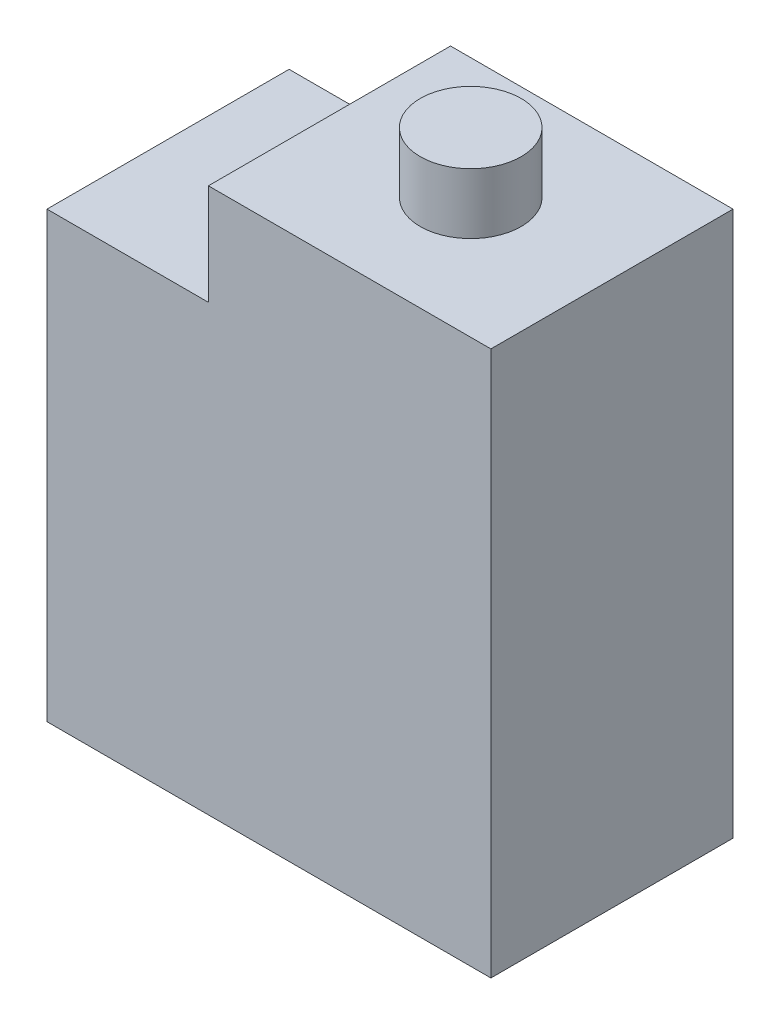
ISO-10303-21;
HEADER;
FILE_DESCRIPTION(('STEP AP214'),'2;1');
FILE_NAME('part.step','',(''),(''),'','','');
FILE_SCHEMA(('AUTOMOTIVE_DESIGN { 1 0 10303 214 1 1 1 1 }'));
ENDSEC;
DATA;
#1=APPLICATION_CONTEXT('core data for automotive mechanical design processes');
#2=APPLICATION_PROTOCOL_DEFINITION('international standard','automotive_design',2000,#1);
#3=PRODUCT_CONTEXT('',#1,'mechanical');
#4=PRODUCT('Part','Part','',(#3));
#5=PRODUCT_RELATED_PRODUCT_CATEGORY('part','',(#4));
#6=PRODUCT_DEFINITION_FORMATION('','',#4);
#7=PRODUCT_DEFINITION_CONTEXT('part definition',#1,'design');
#8=PRODUCT_DEFINITION('design','',#6,#7);
#9=PRODUCT_DEFINITION_SHAPE('','',#8);
#10=(LENGTH_UNIT() NAMED_UNIT(*) SI_UNIT(.MILLI.,.METRE.));
#11=(NAMED_UNIT(*) PLANE_ANGLE_UNIT() SI_UNIT($,.RADIAN.));
#12=(NAMED_UNIT(*) SI_UNIT($,.STERADIAN.) SOLID_ANGLE_UNIT());
#13=UNCERTAINTY_MEASURE_WITH_UNIT(LENGTH_MEASURE(1.E-05),#10,'distance_accuracy_value','');
#14=(GEOMETRIC_REPRESENTATION_CONTEXT(3) GLOBAL_UNCERTAINTY_ASSIGNED_CONTEXT((#13)) GLOBAL_UNIT_ASSIGNED_CONTEXT((#10,
#11,#12)) REPRESENTATION_CONTEXT('',''));
#15=CARTESIAN_POINT('',(0.,0.,0.));
#16=DIRECTION('',(0.,0.,1.));
#17=DIRECTION('',(1.,0.,0.));
#18=AXIS2_PLACEMENT_3D('',#15,#16,#17);
#19=CARTESIAN_POINT('',(0.,22.,0.));
#20=DIRECTION('',(0.,-1.,0.));
#21=DIRECTION('',(0.,0.,-1.));
#22=AXIS2_PLACEMENT_3D('',#19,#20,#21);
#23=PLANE('',#22);
#24=DIRECTION('',(0.,0.,1.));
#25=VECTOR('',#24,1.);
#26=CARTESIAN_POINT('',(-3.,22.,-6.));
#27=LINE('',#26,#25);
#28=CARTESIAN_POINT('',(-3.,22.,-6.));
#29=VERTEX_POINT('',#28);
#30=CARTESIAN_POINT('',(-3.,22.,6.));
#31=VERTEX_POINT('',#30);
#32=EDGE_CURVE('E62',#29,#31,#27,.T.);
#33=ORIENTED_EDGE('',*,*,#32,.F.);
#34=DIRECTION('',(-1.,0.,0.));
#35=VECTOR('',#34,1.);
#36=CARTESIAN_POINT('',(-11.,22.,-6.00000000000001));
#37=LINE('',#36,#35);
#38=CARTESIAN_POINT('',(-11.,22.,-6.00000000000001));
#39=VERTEX_POINT('',#38);
#40=EDGE_CURVE('E100',#29,#39,#37,.T.);
#41=ORIENTED_EDGE('',*,*,#40,.T.);
#42=DIRECTION('',(0.,0.,1.));
#43=VECTOR('',#42,1.);
#44=CARTESIAN_POINT('',(-11.,22.,6.));
#45=LINE('',#44,#43);
#46=CARTESIAN_POINT('',(-11.,22.,6.));
#47=VERTEX_POINT('',#46);
#48=EDGE_CURVE('E68',#39,#47,#45,.T.);
#49=ORIENTED_EDGE('',*,*,#48,.T.);
#50=DIRECTION('',(1.,0.,0.));
#51=VECTOR('',#50,1.);
#52=CARTESIAN_POINT('',(-11.,22.,6.));
#53=LINE('',#52,#51);
#54=EDGE_CURVE('E111',#47,#31,#53,.T.);
#55=ORIENTED_EDGE('',*,*,#54,.T.);
#56=EDGE_LOOP('',(#33,#41,#49,#55));
#57=FACE_BOUND('',#56,.T.);
#58=ADVANCED_FACE('F45',(#57),#23,.F.);
#59=CARTESIAN_POINT('',(11.,22.,6.));
#60=DIRECTION('',(-1.,0.,0.));
#61=DIRECTION('',(0.,0.,1.));
#62=AXIS2_PLACEMENT_3D('',#59,#60,#61);
#63=PLANE('',#62);
#64=DIRECTION('',(0.,0.,-1.));
#65=VECTOR('',#64,1.);
#66=CARTESIAN_POINT('',(11.,0.,6.));
#67=LINE('',#66,#65);
#68=CARTESIAN_POINT('',(11.,0.,6.));
#69=VERTEX_POINT('',#68);
#70=CARTESIAN_POINT('',(11.,0.,-6.));
#71=VERTEX_POINT('',#70);
#72=EDGE_CURVE('E107',#69,#71,#67,.T.);
#73=ORIENTED_EDGE('',*,*,#72,.T.);
#74=DIRECTION('',(0.,-1.,0.));
#75=VECTOR('',#74,1.);
#76=CARTESIAN_POINT('',(11.,22.,-6.));
#77=LINE('',#76,#75);
#78=CARTESIAN_POINT('',(11.,27.,-6.));
#79=VERTEX_POINT('',#78);
#80=EDGE_CURVE('E49',#79,#71,#77,.T.);
#81=ORIENTED_EDGE('',*,*,#80,.F.);
#82=DIRECTION('',(0.,0.,-1.));
#83=VECTOR('',#82,1.);
#84=CARTESIAN_POINT('',(11.,27.,-6.));
#85=LINE('',#84,#83);
#86=CARTESIAN_POINT('',(11.,27.,6.));
#87=VERTEX_POINT('',#86);
#88=EDGE_CURVE('E109',#87,#79,#85,.T.);
#89=ORIENTED_EDGE('',*,*,#88,.F.);
#90=DIRECTION('',(0.,-1.,0.));
#91=VECTOR('',#90,1.);
#92=CARTESIAN_POINT('',(11.,22.,6.));
#93=LINE('',#92,#91);
#94=EDGE_CURVE('E92',#87,#69,#93,.T.);
#95=ORIENTED_EDGE('',*,*,#94,.T.);
#96=EDGE_LOOP('',(#73,#81,#89,#95));
#97=FACE_BOUND('',#96,.T.);
#98=ADVANCED_FACE('F47',(#97),#63,.F.);
#99=CARTESIAN_POINT('',(-11.,22.,-6.00000000000001));
#100=DIRECTION('',(0.,0.,1.));
#101=DIRECTION('',(1.,0.,0.));
#102=AXIS2_PLACEMENT_3D('',#99,#100,#101);
#103=PLANE('',#102);
#104=DIRECTION('',(-1.,0.,0.));
#105=VECTOR('',#104,1.);
#106=CARTESIAN_POINT('',(-11.,0.,-6.00000000000001));
#107=LINE('',#106,#105);
#108=CARTESIAN_POINT('',(-11.,0.,-6.00000000000001));
#109=VERTEX_POINT('',#108);
#110=EDGE_CURVE('E114',#71,#109,#107,.T.);
#111=ORIENTED_EDGE('',*,*,#110,.T.);
#112=DIRECTION('',(0.,-1.,0.));
#113=VECTOR('',#112,1.);
#114=CARTESIAN_POINT('',(-11.,22.,-6.00000000000001));
#115=LINE('',#114,#113);
#116=EDGE_CURVE('E131',#39,#109,#115,.T.);
#117=ORIENTED_EDGE('',*,*,#116,.F.);
#118=ORIENTED_EDGE('',*,*,#40,.F.);
#119=DIRECTION('',(0.,-1.,0.));
#120=VECTOR('',#119,1.);
#121=CARTESIAN_POINT('',(-3.,27.,-6.));
#122=LINE('',#121,#120);
#123=CARTESIAN_POINT('',(-3.,27.,-6.));
#124=VERTEX_POINT('',#123);
#125=EDGE_CURVE('E117',#124,#29,#122,.T.);
#126=ORIENTED_EDGE('',*,*,#125,.F.);
#127=DIRECTION('',(-1.,0.,0.));
#128=VECTOR('',#127,1.);
#129=CARTESIAN_POINT('',(11.,27.,-6.));
#130=LINE('',#129,#128);
#131=EDGE_CURVE('E143',#79,#124,#130,.T.);
#132=ORIENTED_EDGE('',*,*,#131,.F.);
#133=ORIENTED_EDGE('',*,*,#80,.T.);
#134=EDGE_LOOP('',(#111,#117,#118,#126,#132,#133));
#135=FACE_BOUND('',#134,.T.);
#136=ADVANCED_FACE('F139',(#135),#103,.F.);
#137=CARTESIAN_POINT('',(-11.,22.,6.));
#138=DIRECTION('',(1.,0.,0.));
#139=DIRECTION('',(0.,0.,-1.));
#140=AXIS2_PLACEMENT_3D('',#137,#138,#139);
#141=PLANE('',#140);
#142=DIRECTION('',(0.,0.,1.));
#143=VECTOR('',#142,1.);
#144=CARTESIAN_POINT('',(-11.,0.,6.));
#145=LINE('',#144,#143);
#146=CARTESIAN_POINT('',(-11.,0.,6.));
#147=VERTEX_POINT('',#146);
#148=EDGE_CURVE('E101',#109,#147,#145,.T.);
#149=ORIENTED_EDGE('',*,*,#148,.T.);
#150=DIRECTION('',(0.,-1.,0.));
#151=VECTOR('',#150,1.);
#152=CARTESIAN_POINT('',(-11.,22.,6.));
#153=LINE('',#152,#151);
#154=EDGE_CURVE('E95',#47,#147,#153,.T.);
#155=ORIENTED_EDGE('',*,*,#154,.F.);
#156=ORIENTED_EDGE('',*,*,#48,.F.);
#157=ORIENTED_EDGE('',*,*,#116,.T.);
#158=EDGE_LOOP('',(#149,#155,#156,#157));
#159=FACE_BOUND('',#158,.T.);
#160=ADVANCED_FACE('F187',(#159),#141,.F.);
#161=CARTESIAN_POINT('',(-11.,22.,6.));
#162=DIRECTION('',(0.,0.,-1.));
#163=DIRECTION('',(-1.,0.,0.));
#164=AXIS2_PLACEMENT_3D('',#161,#162,#163);
#165=PLANE('',#164);
#166=DIRECTION('',(1.,0.,0.));
#167=VECTOR('',#166,1.);
#168=CARTESIAN_POINT('',(-11.,0.,6.));
#169=LINE('',#168,#167);
#170=EDGE_CURVE('E88',#147,#69,#169,.T.);
#171=ORIENTED_EDGE('',*,*,#170,.T.);
#172=ORIENTED_EDGE('',*,*,#94,.F.);
#173=DIRECTION('',(1.,0.,0.));
#174=VECTOR('',#173,1.);
#175=CARTESIAN_POINT('',(11.,27.,6.));
#176=LINE('',#175,#174);
#177=CARTESIAN_POINT('',(-3.,27.,6.));
#178=VERTEX_POINT('',#177);
#179=EDGE_CURVE('E157',#178,#87,#176,.T.);
#180=ORIENTED_EDGE('',*,*,#179,.F.);
#181=DIRECTION('',(0.,-1.,0.));
#182=VECTOR('',#181,1.);
#183=CARTESIAN_POINT('',(-3.,27.,6.));
#184=LINE('',#183,#182);
#185=EDGE_CURVE('E123',#178,#31,#184,.T.);
#186=ORIENTED_EDGE('',*,*,#185,.T.);
#187=ORIENTED_EDGE('',*,*,#54,.F.);
#188=ORIENTED_EDGE('',*,*,#154,.T.);
#189=EDGE_LOOP('',(#171,#172,#180,#186,#187,#188));
#190=FACE_BOUND('',#189,.T.);
#191=ADVANCED_FACE('F90',(#190),#165,.F.);
#192=CARTESIAN_POINT('',(0.,0.,0.));
#193=DIRECTION('',(0.,-1.,0.));
#194=DIRECTION('',(0.,0.,-1.));
#195=AXIS2_PLACEMENT_3D('',#192,#193,#194);
#196=PLANE('',#195);
#197=ORIENTED_EDGE('',*,*,#72,.F.);
#198=ORIENTED_EDGE('',*,*,#170,.F.);
#199=ORIENTED_EDGE('',*,*,#148,.F.);
#200=ORIENTED_EDGE('',*,*,#110,.F.);
#201=EDGE_LOOP('',(#197,#198,#199,#200));
#202=FACE_BOUND('',#201,.T.);
#203=ADVANCED_FACE('F113',(#202),#196,.T.);
#204=CARTESIAN_POINT('',(-3.,27.,-6.));
#205=DIRECTION('',(1.,0.,0.));
#206=DIRECTION('',(0.,0.,-1.));
#207=AXIS2_PLACEMENT_3D('',#204,#205,#206);
#208=PLANE('',#207);
#209=ORIENTED_EDGE('',*,*,#32,.T.);
#210=ORIENTED_EDGE('',*,*,#185,.F.);
#211=DIRECTION('',(0.,0.,1.));
#212=VECTOR('',#211,1.);
#213=CARTESIAN_POINT('',(-3.,27.,-6.));
#214=LINE('',#213,#212);
#215=EDGE_CURVE('E154',#124,#178,#214,.T.);
#216=ORIENTED_EDGE('',*,*,#215,.F.);
#217=ORIENTED_EDGE('',*,*,#125,.T.);
#218=EDGE_LOOP('',(#209,#210,#216,#217));
#219=FACE_BOUND('',#218,.T.);
#220=ADVANCED_FACE('F162',(#219),#208,.F.);
#221=CARTESIAN_POINT('',(0.,27.,0.));
#222=DIRECTION('',(0.,-1.,0.));
#223=DIRECTION('',(0.,0.,-1.));
#224=AXIS2_PLACEMENT_3D('',#221,#222,#223);
#225=PLANE('',#224);
#226=CARTESIAN_POINT('',(4.,27.,0.));
#227=DIRECTION('',(0.,1.,0.));
#228=DIRECTION('',(0.,0.,1.));
#229=AXIS2_PLACEMENT_3D('',#226,#227,#228);
#230=CIRCLE('',#229,2.5);
#231=CARTESIAN_POINT('',(4.,27.,2.5));
#232=VERTEX_POINT('',#231);
#233=EDGE_CURVE('E11',#232,#232,#230,.T.);
#234=ORIENTED_EDGE('',*,*,#233,.F.);
#235=EDGE_LOOP('',(#234));
#236=FACE_BOUND('',#235,.T.);
#237=ORIENTED_EDGE('',*,*,#88,.T.);
#238=ORIENTED_EDGE('',*,*,#131,.T.);
#239=ORIENTED_EDGE('',*,*,#215,.T.);
#240=ORIENTED_EDGE('',*,*,#179,.T.);
#241=EDGE_LOOP('',(#237,#238,#239,#240));
#242=FACE_BOUND('',#241,.T.);
#243=ADVANCED_FACE('F156',(#236,#242),#225,.F.);
#244=CARTESIAN_POINT('',(4.,30.,0.));
#245=DIRECTION('',(0.,-1.,0.));
#246=DIRECTION('',(0.,0.,-1.));
#247=AXIS2_PLACEMENT_3D('',#244,#245,#246);
#248=CYLINDRICAL_SURFACE('',#247,2.5);
#249=CARTESIAN_POINT('',(4.,30.,0.));
#250=DIRECTION('',(0.,1.,0.));
#251=DIRECTION('',(0.,0.,1.));
#252=AXIS2_PLACEMENT_3D('',#249,#250,#251);
#253=CIRCLE('',#252,2.5);
#254=CARTESIAN_POINT('',(4.,30.,2.5));
#255=VERTEX_POINT('',#254);
#256=EDGE_CURVE('E170',#255,#255,#253,.T.);
#257=ORIENTED_EDGE('',*,*,#256,.F.);
#258=EDGE_LOOP('',(#257));
#259=FACE_BOUND('',#258,.T.);
#260=ORIENTED_EDGE('',*,*,#233,.T.);
#261=EDGE_LOOP('',(#260));
#262=FACE_BOUND('',#261,.T.);
#263=ADVANCED_FACE('F212',(#259,#262),#248,.T.);
#264=CARTESIAN_POINT('',(4.,30.,0.));
#265=DIRECTION('',(0.,1.,0.));
#266=DIRECTION('',(0.,0.,1.));
#267=AXIS2_PLACEMENT_3D('',#264,#265,#266);
#268=PLANE('',#267);
#269=ORIENTED_EDGE('',*,*,#256,.T.);
#270=EDGE_LOOP('',(#269));
#271=FACE_BOUND('',#270,.T.);
#272=ADVANCED_FACE('F220',(#271),#268,.T.);
#273=CLOSED_SHELL('',(#58,#98,#136,#160,#191,#203,#220,#243,#263,#272));
#274=MANIFOLD_SOLID_BREP('B2',#273);
#275=ADVANCED_BREP_SHAPE_REPRESENTATION('',(#18,#274),#14);
#276=SHAPE_DEFINITION_REPRESENTATION(#9,#275);
ENDSEC;
END-ISO-10303-21;
